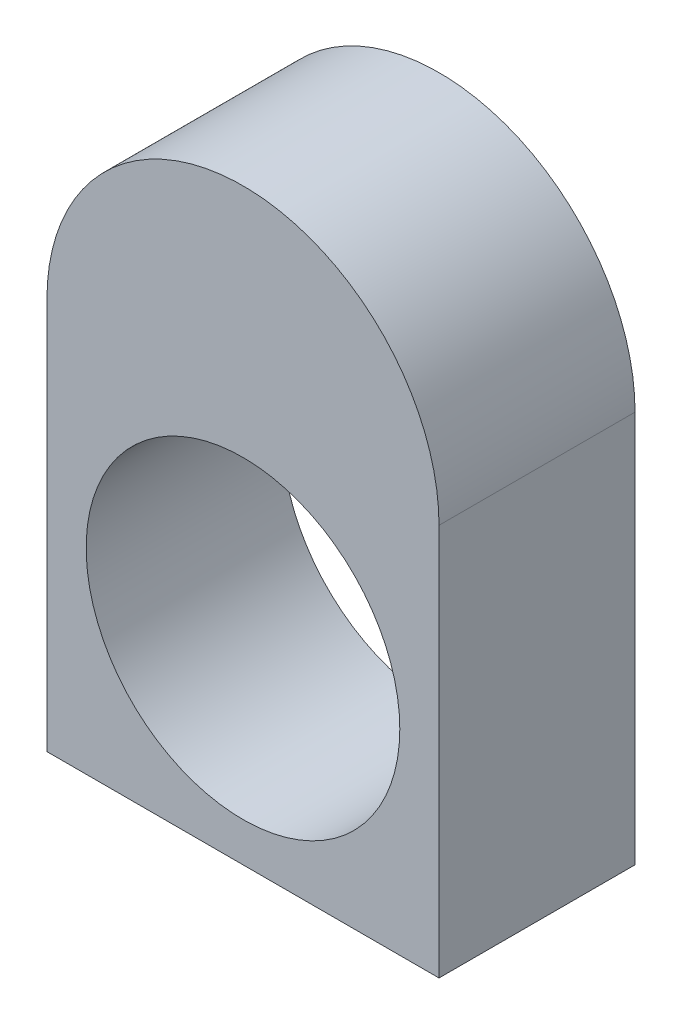
ISO-10303-21;
HEADER;
FILE_DESCRIPTION(('STEP AP214'),'2;1');
FILE_NAME('part.step','',(''),(''),'','','');
FILE_SCHEMA(('AUTOMOTIVE_DESIGN { 1 0 10303 214 1 1 1 1 }'));
ENDSEC;
DATA;
#1=APPLICATION_CONTEXT('core data for automotive mechanical design processes');
#2=APPLICATION_PROTOCOL_DEFINITION('international standard','automotive_design',2000,#1);
#3=PRODUCT_CONTEXT('',#1,'mechanical');
#4=PRODUCT('Part','Part','',(#3));
#5=PRODUCT_RELATED_PRODUCT_CATEGORY('part','',(#4));
#6=PRODUCT_DEFINITION_FORMATION('','',#4);
#7=PRODUCT_DEFINITION_CONTEXT('part definition',#1,'design');
#8=PRODUCT_DEFINITION('design','',#6,#7);
#9=PRODUCT_DEFINITION_SHAPE('','',#8);
#10=(LENGTH_UNIT() NAMED_UNIT(*) SI_UNIT(.MILLI.,.METRE.));
#11=(NAMED_UNIT(*) PLANE_ANGLE_UNIT() SI_UNIT($,.RADIAN.));
#12=(NAMED_UNIT(*) SI_UNIT($,.STERADIAN.) SOLID_ANGLE_UNIT());
#13=UNCERTAINTY_MEASURE_WITH_UNIT(LENGTH_MEASURE(1.E-05),#10,'distance_accuracy_value','');
#14=(GEOMETRIC_REPRESENTATION_CONTEXT(3) GLOBAL_UNCERTAINTY_ASSIGNED_CONTEXT((#13)) GLOBAL_UNIT_ASSIGNED_CONTEXT((#10,
#11,#12)) REPRESENTATION_CONTEXT('',''));
#15=CARTESIAN_POINT('',(0.,0.,0.));
#16=DIRECTION('',(0.,0.,1.));
#17=DIRECTION('',(1.,0.,0.));
#18=AXIS2_PLACEMENT_3D('',#15,#16,#17);
#19=CARTESIAN_POINT('',(1.,-1.,-1.));
#20=DIRECTION('',(1.,0.,0.));
#21=DIRECTION('',(0.,0.,-1.));
#22=AXIS2_PLACEMENT_3D('',#19,#20,#21);
#23=PLANE('',#22);
#24=DIRECTION('',(0.,1.,0.));
#25=VECTOR('',#24,1.);
#26=CARTESIAN_POINT('',(1.,-1.,0.));
#27=LINE('',#26,#25);
#28=CARTESIAN_POINT('',(1.,-1.,0.));
#29=VERTEX_POINT('',#28);
#30=CARTESIAN_POINT('',(1.,1.,0.));
#31=VERTEX_POINT('',#30);
#32=EDGE_CURVE('E81',#29,#31,#27,.T.);
#33=ORIENTED_EDGE('',*,*,#32,.F.);
#34=DIRECTION('',(0.,0.,1.));
#35=VECTOR('',#34,1.);
#36=CARTESIAN_POINT('',(1.,-1.,-1.));
#37=LINE('',#36,#35);
#38=CARTESIAN_POINT('',(1.,-1.,-1.));
#39=VERTEX_POINT('',#38);
#40=EDGE_CURVE('E11',#39,#29,#37,.T.);
#41=ORIENTED_EDGE('',*,*,#40,.F.);
#42=DIRECTION('',(0.,1.,0.));
#43=VECTOR('',#42,1.);
#44=CARTESIAN_POINT('',(1.,-1.,-1.));
#45=LINE('',#44,#43);
#46=CARTESIAN_POINT('',(1.,1.,-1.));
#47=VERTEX_POINT('',#46);
#48=EDGE_CURVE('E90',#39,#47,#45,.T.);
#49=ORIENTED_EDGE('',*,*,#48,.T.);
#50=DIRECTION('',(0.,0.,1.));
#51=VECTOR('',#50,1.);
#52=CARTESIAN_POINT('',(1.,1.,-1.));
#53=LINE('',#52,#51);
#54=EDGE_CURVE('E42',#47,#31,#53,.T.);
#55=ORIENTED_EDGE('',*,*,#54,.T.);
#56=EDGE_LOOP('',(#33,#41,#49,#55));
#57=FACE_BOUND('',#56,.T.);
#58=ADVANCED_FACE('F39',(#57),#23,.T.);
#59=CARTESIAN_POINT('',(1.,-1.,-1.));
#60=DIRECTION('',(0.,-1.,0.));
#61=DIRECTION('',(1.,0.,0.));
#62=AXIS2_PLACEMENT_3D('',#59,#60,#61);
#63=PLANE('',#62);
#64=DIRECTION('',(1.,0.,0.));
#65=VECTOR('',#64,1.);
#66=CARTESIAN_POINT('',(1.,-1.,0.));
#67=LINE('',#66,#65);
#68=CARTESIAN_POINT('',(-1.,-1.,0.));
#69=VERTEX_POINT('',#68);
#70=EDGE_CURVE('E76',#69,#29,#67,.T.);
#71=ORIENTED_EDGE('',*,*,#70,.F.);
#72=DIRECTION('',(0.,0.,1.));
#73=VECTOR('',#72,1.);
#74=CARTESIAN_POINT('',(-1.,-1.,-1.));
#75=LINE('',#74,#73);
#76=CARTESIAN_POINT('',(-1.,-1.,-1.));
#77=VERTEX_POINT('',#76);
#78=EDGE_CURVE('E49',#77,#69,#75,.T.);
#79=ORIENTED_EDGE('',*,*,#78,.F.);
#80=DIRECTION('',(1.,0.,0.));
#81=VECTOR('',#80,1.);
#82=CARTESIAN_POINT('',(1.,-1.,-1.));
#83=LINE('',#82,#81);
#84=EDGE_CURVE('E78',#77,#39,#83,.T.);
#85=ORIENTED_EDGE('',*,*,#84,.T.);
#86=ORIENTED_EDGE('',*,*,#40,.T.);
#87=EDGE_LOOP('',(#71,#79,#85,#86));
#88=FACE_BOUND('',#87,.T.);
#89=ADVANCED_FACE('F74',(#88),#63,.T.);
#90=CARTESIAN_POINT('',(-1.,-1.,-1.));
#91=DIRECTION('',(-1.,0.,0.));
#92=DIRECTION('',(0.,-1.,0.));
#93=AXIS2_PLACEMENT_3D('',#90,#91,#92);
#94=PLANE('',#93);
#95=DIRECTION('',(0.,-1.,0.));
#96=VECTOR('',#95,1.);
#97=CARTESIAN_POINT('',(-1.,-1.,0.));
#98=LINE('',#97,#96);
#99=CARTESIAN_POINT('',(-1.,1.,0.));
#100=VERTEX_POINT('',#99);
#101=EDGE_CURVE('E85',#100,#69,#98,.T.);
#102=ORIENTED_EDGE('',*,*,#101,.F.);
#103=DIRECTION('',(0.,0.,1.));
#104=VECTOR('',#103,1.);
#105=CARTESIAN_POINT('',(-1.,1.,-1.));
#106=LINE('',#105,#104);
#107=CARTESIAN_POINT('',(-1.,1.,-1.));
#108=VERTEX_POINT('',#107);
#109=EDGE_CURVE('E99',#108,#100,#106,.T.);
#110=ORIENTED_EDGE('',*,*,#109,.F.);
#111=DIRECTION('',(0.,-1.,0.));
#112=VECTOR('',#111,1.);
#113=CARTESIAN_POINT('',(-1.,-1.,-1.));
#114=LINE('',#113,#112);
#115=EDGE_CURVE('E94',#108,#77,#114,.T.);
#116=ORIENTED_EDGE('',*,*,#115,.T.);
#117=ORIENTED_EDGE('',*,*,#78,.T.);
#118=EDGE_LOOP('',(#102,#110,#116,#117));
#119=FACE_BOUND('',#118,.T.);
#120=ADVANCED_FACE('F143',(#119),#94,.T.);
#121=CARTESIAN_POINT('',(0.,0.,-1.));
#122=DIRECTION('',(0.,0.,1.));
#123=DIRECTION('',(1.,0.,0.));
#124=AXIS2_PLACEMENT_3D('',#121,#122,#123);
#125=PLANE('',#124);
#126=CARTESIAN_POINT('',(0.,0.,-1.));
#127=DIRECTION('',(0.,0.,1.));
#128=DIRECTION('',(1.,0.,0.));
#129=AXIS2_PLACEMENT_3D('',#126,#127,#128);
#130=CIRCLE('',#129,0.8);
#131=CARTESIAN_POINT('',(0.8,0.,-1.));
#132=VERTEX_POINT('',#131);
#133=EDGE_CURVE('E115',#132,#132,#130,.T.);
#134=ORIENTED_EDGE('',*,*,#133,.T.);
#135=EDGE_LOOP('',(#134));
#136=FACE_BOUND('',#135,.T.);
#137=ORIENTED_EDGE('',*,*,#115,.F.);
#138=CARTESIAN_POINT('',(0.,1.,-1.));
#139=DIRECTION('',(0.,0.,1.));
#140=DIRECTION('',(1.,0.,0.));
#141=AXIS2_PLACEMENT_3D('',#138,#139,#140);
#142=CIRCLE('',#141,1.);
#143=EDGE_CURVE('E86',#47,#108,#142,.T.);
#144=ORIENTED_EDGE('',*,*,#143,.F.);
#145=ORIENTED_EDGE('',*,*,#48,.F.);
#146=ORIENTED_EDGE('',*,*,#84,.F.);
#147=EDGE_LOOP('',(#137,#144,#145,#146));
#148=FACE_BOUND('',#147,.T.);
#149=ADVANCED_FACE('F126',(#136,#148),#125,.F.);
#150=CARTESIAN_POINT('',(0.,0.,0.));
#151=DIRECTION('',(0.,0.,1.));
#152=DIRECTION('',(1.,0.,0.));
#153=AXIS2_PLACEMENT_3D('',#150,#151,#152);
#154=PLANE('',#153);
#155=CARTESIAN_POINT('',(0.,0.,0.));
#156=DIRECTION('',(0.,0.,1.));
#157=DIRECTION('',(1.,0.,0.));
#158=AXIS2_PLACEMENT_3D('',#155,#156,#157);
#159=CIRCLE('',#158,0.8);
#160=CARTESIAN_POINT('',(0.8,0.,0.));
#161=VERTEX_POINT('',#160);
#162=EDGE_CURVE('E118',#161,#161,#159,.T.);
#163=ORIENTED_EDGE('',*,*,#162,.F.);
#164=EDGE_LOOP('',(#163));
#165=FACE_BOUND('',#164,.T.);
#166=ORIENTED_EDGE('',*,*,#32,.T.);
#167=CARTESIAN_POINT('',(0.,1.,0.));
#168=DIRECTION('',(0.,0.,1.));
#169=DIRECTION('',(1.,0.,0.));
#170=AXIS2_PLACEMENT_3D('',#167,#168,#169);
#171=CIRCLE('',#170,1.);
#172=EDGE_CURVE('E112',#31,#100,#171,.T.);
#173=ORIENTED_EDGE('',*,*,#172,.T.);
#174=ORIENTED_EDGE('',*,*,#101,.T.);
#175=ORIENTED_EDGE('',*,*,#70,.T.);
#176=EDGE_LOOP('',(#166,#173,#174,#175));
#177=FACE_BOUND('',#176,.T.);
#178=ADVANCED_FACE('F88',(#165,#177),#154,.T.);
#179=CARTESIAN_POINT('',(0.,1.,-1.));
#180=DIRECTION('',(0.,0.,1.));
#181=DIRECTION('',(1.,0.,0.));
#182=AXIS2_PLACEMENT_3D('',#179,#180,#181);
#183=CYLINDRICAL_SURFACE('',#182,1.);
#184=ORIENTED_EDGE('',*,*,#143,.T.);
#185=ORIENTED_EDGE('',*,*,#109,.T.);
#186=ORIENTED_EDGE('',*,*,#172,.F.);
#187=ORIENTED_EDGE('',*,*,#54,.F.);
#188=EDGE_LOOP('',(#184,#185,#186,#187));
#189=FACE_BOUND('',#188,.T.);
#190=ADVANCED_FACE('F132',(#189),#183,.T.);
#191=CARTESIAN_POINT('',(0.,0.,-1.));
#192=DIRECTION('',(0.,0.,1.));
#193=DIRECTION('',(1.,0.,0.));
#194=AXIS2_PLACEMENT_3D('',#191,#192,#193);
#195=CYLINDRICAL_SURFACE('',#194,0.8);
#196=ORIENTED_EDGE('',*,*,#133,.F.);
#197=EDGE_LOOP('',(#196));
#198=FACE_BOUND('',#197,.T.);
#199=ORIENTED_EDGE('',*,*,#162,.T.);
#200=EDGE_LOOP('',(#199));
#201=FACE_BOUND('',#200,.T.);
#202=ADVANCED_FACE('F129',(#198,#201),#195,.F.);
#203=CLOSED_SHELL('',(#58,#89,#120,#149,#178,#190,#202));
#204=MANIFOLD_SOLID_BREP('B2',#203);
#205=ADVANCED_BREP_SHAPE_REPRESENTATION('',(#18,#204),#14);
#206=SHAPE_DEFINITION_REPRESENTATION(#9,#205);
ENDSEC;
END-ISO-10303-21;
